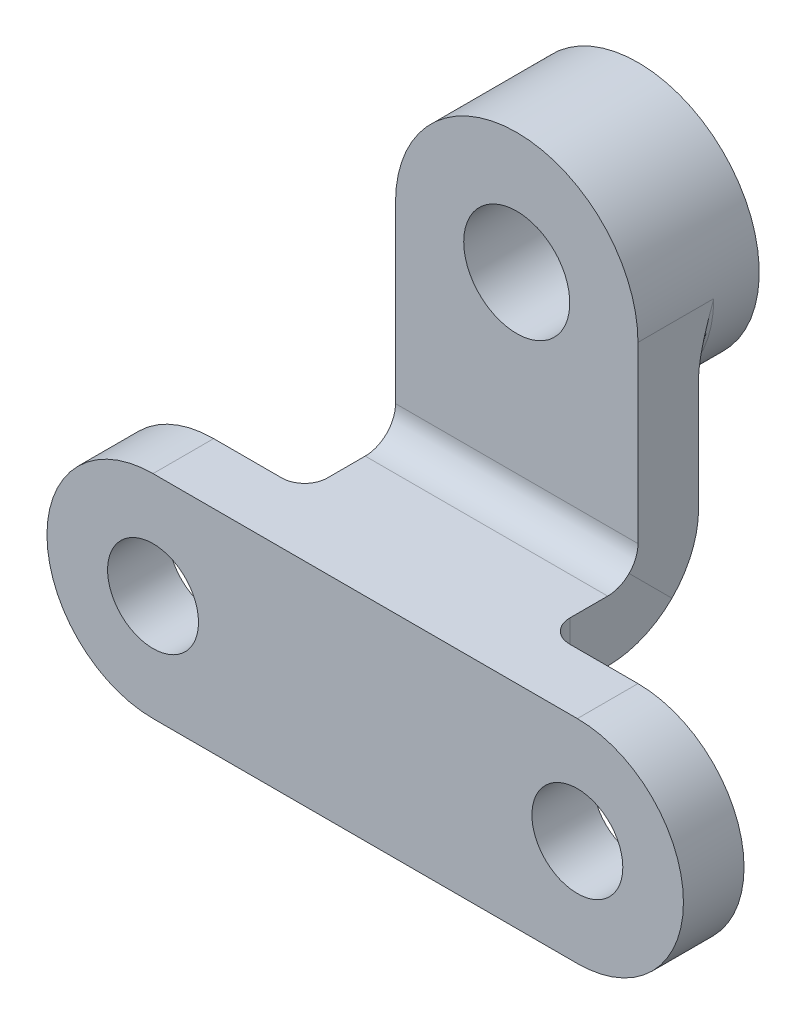
ISO-10303-21;
HEADER;
FILE_DESCRIPTION(('STEP AP214'),'2;1');
FILE_NAME('part.step','',(''),(''),'','','');
FILE_SCHEMA(('AUTOMOTIVE_DESIGN { 1 0 10303 214 1 1 1 1 }'));
ENDSEC;
DATA;
#1=APPLICATION_CONTEXT('core data for automotive mechanical design processes');
#2=APPLICATION_PROTOCOL_DEFINITION('international standard','automotive_design',2000,#1);
#3=PRODUCT_CONTEXT('',#1,'mechanical');
#4=PRODUCT('Part','Part','',(#3));
#5=PRODUCT_RELATED_PRODUCT_CATEGORY('part','',(#4));
#6=PRODUCT_DEFINITION_FORMATION('','',#4);
#7=PRODUCT_DEFINITION_CONTEXT('part definition',#1,'design');
#8=PRODUCT_DEFINITION('design','',#6,#7);
#9=PRODUCT_DEFINITION_SHAPE('','',#8);
#10=(LENGTH_UNIT() NAMED_UNIT(*) SI_UNIT(.MILLI.,.METRE.));
#11=(NAMED_UNIT(*) PLANE_ANGLE_UNIT() SI_UNIT($,.RADIAN.));
#12=(NAMED_UNIT(*) SI_UNIT($,.STERADIAN.) SOLID_ANGLE_UNIT());
#13=UNCERTAINTY_MEASURE_WITH_UNIT(LENGTH_MEASURE(1.E-05),#10,'distance_accuracy_value','');
#14=(GEOMETRIC_REPRESENTATION_CONTEXT(3) GLOBAL_UNCERTAINTY_ASSIGNED_CONTEXT((#13)) GLOBAL_UNIT_ASSIGNED_CONTEXT((#10,
#11,#12)) REPRESENTATION_CONTEXT('',''));
#15=CARTESIAN_POINT('',(0.,0.,0.));
#16=DIRECTION('',(0.,0.,1.));
#17=DIRECTION('',(1.,0.,0.));
#18=AXIS2_PLACEMENT_3D('',#15,#16,#17);
#19=CARTESIAN_POINT('',(20.,6.9,-25.));
#20=DIRECTION('',(0.,0.,-1.));
#21=DIRECTION('',(-1.,0.,0.));
#22=AXIS2_PLACEMENT_3D('',#19,#20,#21);
#23=PLANE('',#22);
#24=DIRECTION('',(0.,1.,0.));
#25=VECTOR('',#24,1.);
#26=CARTESIAN_POINT('',(-20.,6.9,-25.));
#27=LINE('',#26,#25);
#28=CARTESIAN_POINT('',(-20.,22.5,-25.));
#29=VERTEX_POINT('',#28);
#30=CARTESIAN_POINT('',(-20.,40.9422359359558,-25.));
#31=VERTEX_POINT('',#30);
#32=EDGE_CURVE('E212',#29,#31,#27,.T.);
#33=ORIENTED_EDGE('',*,*,#32,.T.);
#34=CARTESIAN_POINT('',(0.,51.25,-25.));
#35=DIRECTION('',(0.,0.,-1.));
#36=DIRECTION('',(-1.,0.,0.));
#37=AXIS2_PLACEMENT_3D('',#34,#35,#36);
#38=CIRCLE('',#37,22.5);
#39=CARTESIAN_POINT('',(20.,40.9422359359558,-25.));
#40=VERTEX_POINT('',#39);
#41=EDGE_CURVE('E325',#31,#40,#38,.F.);
#42=ORIENTED_EDGE('',*,*,#41,.T.);
#43=DIRECTION('',(0.,1.,0.));
#44=VECTOR('',#43,1.);
#45=CARTESIAN_POINT('',(20.,6.9,-25.));
#46=LINE('',#45,#44);
#47=CARTESIAN_POINT('',(20.,22.5,-25.));
#48=VERTEX_POINT('',#47);
#49=EDGE_CURVE('E208',#48,#40,#46,.T.);
#50=ORIENTED_EDGE('',*,*,#49,.F.);
#51=DIRECTION('',(1.,0.,0.));
#52=VECTOR('',#51,1.);
#53=CARTESIAN_POINT('',(20.,22.5,-25.));
#54=LINE('',#53,#52);
#55=EDGE_CURVE('E310',#48,#29,#54,.F.);
#56=ORIENTED_EDGE('',*,*,#55,.T.);
#57=EDGE_LOOP('',(#33,#42,#50,#56));
#58=FACE_BOUND('',#57,.T.);
#59=ADVANCED_FACE('F44',(#58),#23,.T.);
#60=CARTESIAN_POINT('',(-20.,6.9,-15.));
#61=DIRECTION('',(-1.,0.,0.));
#62=DIRECTION('',(0.,0.,1.));
#63=AXIS2_PLACEMENT_3D('',#60,#61,#62);
#64=PLANE('',#63);
#65=DIRECTION('',(0.,1.,0.));
#66=VECTOR('',#65,1.);
#67=CARTESIAN_POINT('',(-20.,6.9,-15.));
#68=LINE('',#67,#66);
#69=CARTESIAN_POINT('',(-20.,22.5,-15.));
#70=VERTEX_POINT('',#69);
#71=CARTESIAN_POINT('',(-20.,51.25,-15.));
#72=VERTEX_POINT('',#71);
#73=EDGE_CURVE('E203',#70,#72,#68,.T.);
#74=ORIENTED_EDGE('',*,*,#73,.T.);
#75=DIRECTION('',(0.,0.,-1.));
#76=VECTOR('',#75,1.);
#77=CARTESIAN_POINT('',(-20.,51.25,-15.));
#78=LINE('',#77,#76);
#79=CARTESIAN_POINT('',(-20.,51.25,-27.5));
#80=VERTEX_POINT('',#79);
#81=EDGE_CURVE('E185',#72,#80,#78,.T.);
#82=ORIENTED_EDGE('',*,*,#81,.T.);
#83=CARTESIAN_POINT('',(-20.,40.9422359359558,-25.));
#84=CARTESIAN_POINT('',(-20.,41.1549385100876,-25.0000449764851));
#85=CARTESIAN_POINT('',(-20.,41.3675707273067,-25.0056945692452));
#86=CARTESIAN_POINT('',(-20.,41.7922321200289,-25.0268780276172));
#87=CARTESIAN_POINT('',(-20.,42.0042615679865,-25.0424063173453));
#88=CARTESIAN_POINT('',(-20.,42.4269762163832,-25.0819766027299));
#89=CARTESIAN_POINT('',(-20.,42.6376634390875,-25.1059976023904));
#90=CARTESIAN_POINT('',(-20.,43.0580713599332,-25.1615157552071));
#91=CARTESIAN_POINT('',(-20.,43.2677919000022,-25.1930140897336));
#92=CARTESIAN_POINT('',(-20.,43.8920865101934,-25.2967730019633));
#93=CARTESIAN_POINT('',(-20.,44.305072940473,-25.3786349271692));
#94=CARTESIAN_POINT('',(-20.,45.1267992180475,-25.5621731553434));
#95=CARTESIAN_POINT('',(-20.,45.5355358287488,-25.6638635395823));
#96=CARTESIAN_POINT('',(-20.,46.3890349229857,-25.8930268313263));
#97=CARTESIAN_POINT('',(-20.,46.8333760284888,-26.022053241113));
#98=CARTESIAN_POINT('',(-20.,47.7179860727412,-26.2929067219359));
#99=CARTESIAN_POINT('',(-20.,48.1582558066702,-26.4347312325629));
#100=CARTESIAN_POINT('',(-20.,49.4762792108555,-26.8729727330476));
#101=CARTESIAN_POINT('',(-20.,50.3498647837027,-27.1817549134738));
#102=CARTESIAN_POINT('',(-20.,51.2322222285168,-27.4937146196007));
#103=CARTESIAN_POINT('',(-20.,51.2411111174545,-27.4968573166572));
#104=CARTESIAN_POINT('',(-20.,51.25,-27.5));
#105=B_SPLINE_CURVE_WITH_KNOTS('',3,(#83,#84,#85,#86,#87,#88,#89,#90,#91,#92,#93,#94,#95,#96,
#97,#98,#99,#100,#101,#102,#103,#104),.UNSPECIFIED.,.F.,.F.,(4,2,2,2,2,2,2,2,2,2,4),(0.,
0.637933377938518,1.27550700293499,1.91151529126964,2.54762413173433,3.80997097214285,
5.0732175604964,6.46101482448389,7.84853505640759,10.627891140098,10.656175411361),.UNSPECIFIED.);
#106=EDGE_CURVE('E324',#80,#31,#105,.F.);
#107=ORIENTED_EDGE('',*,*,#106,.T.);
#108=ORIENTED_EDGE('',*,*,#32,.F.);
#109=CARTESIAN_POINT('',(-20.,22.5,-10.));
#110=DIRECTION('',(-1.,0.,0.));
#111=DIRECTION('',(0.,0.,1.));
#112=AXIS2_PLACEMENT_3D('',#109,#110,#111);
#113=CIRCLE('',#112,15.);
#114=CARTESIAN_POINT('',(-20.,11.8933982822018,-20.6066017177982));
#115=VERTEX_POINT('',#114);
#116=EDGE_CURVE('E315',#29,#115,#113,.T.);
#117=ORIENTED_EDGE('',*,*,#116,.T.);
#118=DIRECTION('',(0.,-0.707106781186548,-0.707106781186548));
#119=VECTOR('',#118,1.);
#120=CARTESIAN_POINT('',(-20.,25.,-7.5));
#121=LINE('',#120,#119);
#122=CARTESIAN_POINT('',(-20.,18.9644660940673,-13.5355339059327));
#123=VERTEX_POINT('',#122);
#124=EDGE_CURVE('E229',#123,#115,#121,.T.);
#125=ORIENTED_EDGE('',*,*,#124,.F.);
#126=CARTESIAN_POINT('',(-20.,22.5,-10.));
#127=DIRECTION('',(-1.,0.,0.));
#128=DIRECTION('',(0.,0.,1.));
#129=AXIS2_PLACEMENT_3D('',#126,#127,#128);
#130=CIRCLE('',#129,5.);
#131=EDGE_CURVE('E287',#123,#70,#130,.F.);
#132=ORIENTED_EDGE('',*,*,#131,.T.);
#133=EDGE_LOOP('',(#74,#82,#107,#108,#117,#125,#132));
#134=FACE_BOUND('',#133,.T.);
#135=ADVANCED_FACE('F338',(#134),#64,.T.);
#136=CARTESIAN_POINT('',(-35.,0.,0.));
#137=DIRECTION('',(0.,0.,1.));
#138=DIRECTION('',(1.,0.,0.));
#139=AXIS2_PLACEMENT_3D('',#136,#137,#138);
#140=PLANE('',#139);
#141=CARTESIAN_POINT('',(35.,0.,0.));
#142=DIRECTION('',(0.,0.,1.));
#143=DIRECTION('',(1.,0.,0.));
#144=AXIS2_PLACEMENT_3D('',#141,#142,#143);
#145=CIRCLE('',#144,7.5);
#146=CARTESIAN_POINT('',(42.5,0.,0.));
#147=VERTEX_POINT('',#146);
#148=EDGE_CURVE('E224',#147,#147,#145,.T.);
#149=ORIENTED_EDGE('',*,*,#148,.T.);
#150=EDGE_LOOP('',(#149));
#151=FACE_BOUND('',#150,.T.);
#152=CARTESIAN_POINT('',(-35.,0.,0.));
#153=DIRECTION('',(0.,0.,1.));
#154=DIRECTION('',(1.,0.,0.));
#155=AXIS2_PLACEMENT_3D('',#152,#153,#154);
#156=CIRCLE('',#155,7.5);
#157=CARTESIAN_POINT('',(-27.5,0.,0.));
#158=VERTEX_POINT('',#157);
#159=EDGE_CURVE('E225',#158,#158,#156,.T.);
#160=ORIENTED_EDGE('',*,*,#159,.T.);
#161=EDGE_LOOP('',(#160));
#162=FACE_BOUND('',#161,.T.);
#163=DIRECTION('',(0.,1.,0.));
#164=VECTOR('',#163,1.);
#165=CARTESIAN_POINT('',(-23.75,0.,0.));
#166=LINE('',#165,#164);
#167=CARTESIAN_POINT('',(-23.75,17.5,0.));
#168=VERTEX_POINT('',#167);
#169=CARTESIAN_POINT('',(-23.75,5.,0.));
#170=VERTEX_POINT('',#169);
#171=EDGE_CURVE('E66',#168,#170,#166,.F.);
#172=ORIENTED_EDGE('',*,*,#171,.T.);
#173=DIRECTION('',(-1.,0.,0.));
#174=VECTOR('',#173,1.);
#175=CARTESIAN_POINT('',(-35.,5.,0.));
#176=LINE('',#175,#174);
#177=CARTESIAN_POINT('',(23.75,5.,0.));
#178=VERTEX_POINT('',#177);
#179=EDGE_CURVE('E368',#170,#178,#176,.F.);
#180=ORIENTED_EDGE('',*,*,#179,.T.);
#181=DIRECTION('',(0.,-1.,0.));
#182=VECTOR('',#181,1.);
#183=CARTESIAN_POINT('',(23.75,0.,0.));
#184=LINE('',#183,#182);
#185=CARTESIAN_POINT('',(23.75,17.5,0.));
#186=VERTEX_POINT('',#185);
#187=EDGE_CURVE('E71',#178,#186,#184,.F.);
#188=ORIENTED_EDGE('',*,*,#187,.T.);
#189=DIRECTION('',(-1.,0.,0.));
#190=VECTOR('',#189,1.);
#191=CARTESIAN_POINT('',(-35.,17.5,0.));
#192=LINE('',#191,#190);
#193=CARTESIAN_POINT('',(35.,17.5,0.));
#194=VERTEX_POINT('',#193);
#195=EDGE_CURVE('E242',#194,#186,#192,.T.);
#196=ORIENTED_EDGE('',*,*,#195,.F.);
#197=CARTESIAN_POINT('',(35.,0.,0.));
#198=DIRECTION('',(0.,0.,1.));
#199=DIRECTION('',(1.,0.,0.));
#200=AXIS2_PLACEMENT_3D('',#197,#198,#199);
#201=CIRCLE('',#200,17.5);
#202=CARTESIAN_POINT('',(35.,-17.5,0.));
#203=VERTEX_POINT('',#202);
#204=EDGE_CURVE('E260',#203,#194,#201,.T.);
#205=ORIENTED_EDGE('',*,*,#204,.F.);
#206=DIRECTION('',(1.,0.,0.));
#207=VECTOR('',#206,1.);
#208=CARTESIAN_POINT('',(-35.,-17.5,0.));
#209=LINE('',#208,#207);
#210=CARTESIAN_POINT('',(-35.,-17.5,0.));
#211=VERTEX_POINT('',#210);
#212=EDGE_CURVE('E255',#211,#203,#209,.T.);
#213=ORIENTED_EDGE('',*,*,#212,.F.);
#214=CARTESIAN_POINT('',(-35.,0.,0.));
#215=DIRECTION('',(0.,0.,1.));
#216=DIRECTION('',(1.,0.,0.));
#217=AXIS2_PLACEMENT_3D('',#214,#215,#216);
#218=CIRCLE('',#217,17.5);
#219=CARTESIAN_POINT('',(-35.,17.5,0.));
#220=VERTEX_POINT('',#219);
#221=EDGE_CURVE('E235',#220,#211,#218,.T.);
#222=ORIENTED_EDGE('',*,*,#221,.F.);
#223=EDGE_CURVE('E257',#168,#220,#192,.T.);
#224=ORIENTED_EDGE('',*,*,#223,.F.);
#225=EDGE_LOOP('',(#172,#180,#188,#196,#205,#213,#222,#224));
#226=FACE_BOUND('',#225,.T.);
#227=ADVANCED_FACE('F462',(#151,#162,#226),#140,.F.);
#228=CARTESIAN_POINT('',(-35.,0.,10.));
#229=DIRECTION('',(0.,0.,1.));
#230=DIRECTION('',(1.,0.,0.));
#231=AXIS2_PLACEMENT_3D('',#228,#229,#230);
#232=PLANE('',#231);
#233=CARTESIAN_POINT('',(-35.,0.,10.));
#234=DIRECTION('',(0.,0.,1.));
#235=DIRECTION('',(1.,0.,0.));
#236=AXIS2_PLACEMENT_3D('',#233,#234,#235);
#237=CIRCLE('',#236,7.5);
#238=CARTESIAN_POINT('',(-27.5,0.,10.));
#239=VERTEX_POINT('',#238);
#240=EDGE_CURVE('E230',#239,#239,#237,.T.);
#241=ORIENTED_EDGE('',*,*,#240,.F.);
#242=EDGE_LOOP('',(#241));
#243=FACE_BOUND('',#242,.T.);
#244=CARTESIAN_POINT('',(-35.,0.,10.));
#245=DIRECTION('',(0.,0.,1.));
#246=DIRECTION('',(1.,0.,0.));
#247=AXIS2_PLACEMENT_3D('',#244,#245,#246);
#248=CIRCLE('',#247,17.5);
#249=CARTESIAN_POINT('',(-35.,17.5,10.));
#250=VERTEX_POINT('',#249);
#251=CARTESIAN_POINT('',(-35.,-17.5,10.));
#252=VERTEX_POINT('',#251);
#253=EDGE_CURVE('E237',#250,#252,#248,.T.);
#254=ORIENTED_EDGE('',*,*,#253,.T.);
#255=DIRECTION('',(1.,0.,0.));
#256=VECTOR('',#255,1.);
#257=CARTESIAN_POINT('',(-35.,-17.5,10.));
#258=LINE('',#257,#256);
#259=CARTESIAN_POINT('',(35.,-17.5,10.));
#260=VERTEX_POINT('',#259);
#261=EDGE_CURVE('E238',#252,#260,#258,.T.);
#262=ORIENTED_EDGE('',*,*,#261,.T.);
#263=CARTESIAN_POINT('',(35.,0.,10.));
#264=DIRECTION('',(0.,0.,1.));
#265=DIRECTION('',(1.,0.,0.));
#266=AXIS2_PLACEMENT_3D('',#263,#264,#265);
#267=CIRCLE('',#266,17.5);
#268=CARTESIAN_POINT('',(35.,17.5,10.));
#269=VERTEX_POINT('',#268);
#270=EDGE_CURVE('E241',#260,#269,#267,.T.);
#271=ORIENTED_EDGE('',*,*,#270,.T.);
#272=DIRECTION('',(-1.,0.,0.));
#273=VECTOR('',#272,1.);
#274=CARTESIAN_POINT('',(-35.,17.5,10.));
#275=LINE('',#274,#273);
#276=EDGE_CURVE('E250',#269,#250,#275,.T.);
#277=ORIENTED_EDGE('',*,*,#276,.T.);
#278=EDGE_LOOP('',(#254,#262,#271,#277));
#279=FACE_BOUND('',#278,.T.);
#280=CARTESIAN_POINT('',(35.,0.,10.));
#281=DIRECTION('',(0.,0.,1.));
#282=DIRECTION('',(1.,0.,0.));
#283=AXIS2_PLACEMENT_3D('',#280,#281,#282);
#284=CIRCLE('',#283,7.5);
#285=CARTESIAN_POINT('',(42.5,0.,10.));
#286=VERTEX_POINT('',#285);
#287=EDGE_CURVE('E217',#286,#286,#284,.T.);
#288=ORIENTED_EDGE('',*,*,#287,.F.);
#289=EDGE_LOOP('',(#288));
#290=FACE_BOUND('',#289,.T.);
#291=ADVANCED_FACE('F508',(#243,#279,#290),#232,.T.);
#292=CARTESIAN_POINT('',(-35.,0.,10.));
#293=DIRECTION('',(0.,0.,-1.));
#294=DIRECTION('',(-1.,0.,0.));
#295=AXIS2_PLACEMENT_3D('',#292,#293,#294);
#296=CYLINDRICAL_SURFACE('',#295,17.5);
#297=ORIENTED_EDGE('',*,*,#221,.T.);
#298=DIRECTION('',(0.,0.,-1.));
#299=VECTOR('',#298,1.);
#300=CARTESIAN_POINT('',(-35.,-17.5,10.));
#301=LINE('',#300,#299);
#302=EDGE_CURVE('E274',#252,#211,#301,.T.);
#303=ORIENTED_EDGE('',*,*,#302,.F.);
#304=ORIENTED_EDGE('',*,*,#253,.F.);
#305=DIRECTION('',(0.,0.,-1.));
#306=VECTOR('',#305,1.);
#307=CARTESIAN_POINT('',(-35.,17.5,10.));
#308=LINE('',#307,#306);
#309=EDGE_CURVE('E249',#250,#220,#308,.T.);
#310=ORIENTED_EDGE('',*,*,#309,.T.);
#311=EDGE_LOOP('',(#297,#303,#304,#310));
#312=FACE_BOUND('',#311,.T.);
#313=ADVANCED_FACE('F504',(#312),#296,.T.);
#314=CARTESIAN_POINT('',(-35.,-17.5,10.));
#315=DIRECTION('',(0.,1.,0.));
#316=DIRECTION('',(0.,0.,1.));
#317=AXIS2_PLACEMENT_3D('',#314,#315,#316);
#318=PLANE('',#317);
#319=ORIENTED_EDGE('',*,*,#212,.T.);
#320=DIRECTION('',(0.,0.,-1.));
#321=VECTOR('',#320,1.);
#322=CARTESIAN_POINT('',(35.,-17.5,10.));
#323=LINE('',#322,#321);
#324=EDGE_CURVE('E271',#260,#203,#323,.T.);
#325=ORIENTED_EDGE('',*,*,#324,.F.);
#326=ORIENTED_EDGE('',*,*,#261,.F.);
#327=ORIENTED_EDGE('',*,*,#302,.T.);
#328=EDGE_LOOP('',(#319,#325,#326,#327));
#329=FACE_BOUND('',#328,.T.);
#330=ADVANCED_FACE('F635',(#329),#318,.F.);
#331=CARTESIAN_POINT('',(35.,0.,10.));
#332=DIRECTION('',(0.,0.,-1.));
#333=DIRECTION('',(-1.,0.,0.));
#334=AXIS2_PLACEMENT_3D('',#331,#332,#333);
#335=CYLINDRICAL_SURFACE('',#334,17.5);
#336=ORIENTED_EDGE('',*,*,#204,.T.);
#337=DIRECTION('',(0.,0.,-1.));
#338=VECTOR('',#337,1.);
#339=CARTESIAN_POINT('',(35.,17.5,10.));
#340=LINE('',#339,#338);
#341=EDGE_CURVE('E270',#269,#194,#340,.T.);
#342=ORIENTED_EDGE('',*,*,#341,.F.);
#343=ORIENTED_EDGE('',*,*,#270,.F.);
#344=ORIENTED_EDGE('',*,*,#324,.T.);
#345=EDGE_LOOP('',(#336,#342,#343,#344));
#346=FACE_BOUND('',#345,.T.);
#347=ADVANCED_FACE('F511',(#346),#335,.T.);
#348=CARTESIAN_POINT('',(-35.,17.5,10.));
#349=DIRECTION('',(0.,-1.,0.));
#350=DIRECTION('',(0.,0.,-1.));
#351=AXIS2_PLACEMENT_3D('',#348,#349,#350);
#352=PLANE('',#351);
#353=ORIENTED_EDGE('',*,*,#195,.T.);
#354=CARTESIAN_POINT('',(23.75,17.5,-3.75));
#355=DIRECTION('',(0.,-1.,0.));
#356=DIRECTION('',(0.,0.,-1.));
#357=AXIS2_PLACEMENT_3D('',#354,#355,#356);
#358=CIRCLE('',#357,3.75);
#359=CARTESIAN_POINT('',(20.,17.5,-3.75));
#360=VERTEX_POINT('',#359);
#361=EDGE_CURVE('E373',#186,#360,#358,.T.);
#362=ORIENTED_EDGE('',*,*,#361,.T.);
#363=DIRECTION('',(0.,0.,-1.));
#364=VECTOR('',#363,1.);
#365=CARTESIAN_POINT('',(20.,17.5,0.));
#366=LINE('',#365,#364);
#367=CARTESIAN_POINT('',(20.,17.5,-10.));
#368=VERTEX_POINT('',#367);
#369=EDGE_CURVE('E210',#360,#368,#366,.T.);
#370=ORIENTED_EDGE('',*,*,#369,.T.);
#371=DIRECTION('',(-1.,0.,0.));
#372=VECTOR('',#371,1.);
#373=CARTESIAN_POINT('',(-35.,17.5,-10.));
#374=LINE('',#373,#372);
#375=CARTESIAN_POINT('',(-20.,17.5,-10.));
#376=VERTEX_POINT('',#375);
#377=EDGE_CURVE('E276',#368,#376,#374,.T.);
#378=ORIENTED_EDGE('',*,*,#377,.T.);
#379=DIRECTION('',(0.,0.,-1.));
#380=VECTOR('',#379,1.);
#381=CARTESIAN_POINT('',(-20.,17.5,0.));
#382=LINE('',#381,#380);
#383=CARTESIAN_POINT('',(-20.,17.5,-3.75));
#384=VERTEX_POINT('',#383);
#385=EDGE_CURVE('E410',#384,#376,#382,.T.);
#386=ORIENTED_EDGE('',*,*,#385,.F.);
#387=CARTESIAN_POINT('',(-23.75,17.5,-3.75));
#388=DIRECTION('',(0.,-1.,0.));
#389=DIRECTION('',(0.,0.,-1.));
#390=AXIS2_PLACEMENT_3D('',#387,#388,#389);
#391=CIRCLE('',#390,3.75);
#392=EDGE_CURVE('E382',#384,#168,#391,.T.);
#393=ORIENTED_EDGE('',*,*,#392,.T.);
#394=ORIENTED_EDGE('',*,*,#223,.T.);
#395=ORIENTED_EDGE('',*,*,#309,.F.);
#396=ORIENTED_EDGE('',*,*,#276,.F.);
#397=ORIENTED_EDGE('',*,*,#341,.T.);
#398=EDGE_LOOP('',(#353,#362,#370,#378,#386,#393,#394,#395,#396,#397));
#399=FACE_BOUND('',#398,.T.);
#400=ADVANCED_FACE('F497',(#399),#352,.F.);
#401=CARTESIAN_POINT('',(-35.,0.,10.));
#402=DIRECTION('',(0.,0.,-1.));
#403=DIRECTION('',(-1.,0.,0.));
#404=AXIS2_PLACEMENT_3D('',#401,#402,#403);
#405=CYLINDRICAL_SURFACE('',#404,7.5);
#406=ORIENTED_EDGE('',*,*,#240,.T.);
#407=EDGE_LOOP('',(#406));
#408=FACE_BOUND('',#407,.T.);
#409=ORIENTED_EDGE('',*,*,#159,.F.);
#410=EDGE_LOOP('',(#409));
#411=FACE_BOUND('',#410,.T.);
#412=ADVANCED_FACE('F562',(#408,#411),#405,.F.);
#413=CARTESIAN_POINT('',(35.,0.,10.));
#414=DIRECTION('',(0.,0.,-1.));
#415=DIRECTION('',(-1.,0.,0.));
#416=AXIS2_PLACEMENT_3D('',#413,#414,#415);
#417=CYLINDRICAL_SURFACE('',#416,7.5);
#418=ORIENTED_EDGE('',*,*,#287,.T.);
#419=EDGE_LOOP('',(#418));
#420=FACE_BOUND('',#419,.T.);
#421=ORIENTED_EDGE('',*,*,#148,.F.);
#422=EDGE_LOOP('',(#421));
#423=FACE_BOUND('',#422,.T.);
#424=ADVANCED_FACE('F463',(#420,#423),#417,.F.);
#425=CARTESIAN_POINT('',(20.,6.9,-15.));
#426=DIRECTION('',(1.,0.,0.));
#427=DIRECTION('',(0.,0.,-1.));
#428=AXIS2_PLACEMENT_3D('',#425,#426,#427);
#429=PLANE('',#428);
#430=DIRECTION('',(0.,0.,-1.));
#431=VECTOR('',#430,1.);
#432=CARTESIAN_POINT('',(20.,51.25,-15.));
#433=LINE('',#432,#431);
#434=CARTESIAN_POINT('',(20.,51.25,-15.));
#435=VERTEX_POINT('',#434);
#436=CARTESIAN_POINT('',(20.,51.25,-27.5));
#437=VERTEX_POINT('',#436);
#438=EDGE_CURVE('E179',#435,#437,#433,.T.);
#439=ORIENTED_EDGE('',*,*,#438,.F.);
#440=DIRECTION('',(0.,1.,0.));
#441=VECTOR('',#440,1.);
#442=CARTESIAN_POINT('',(20.,6.9,-15.));
#443=LINE('',#442,#441);
#444=CARTESIAN_POINT('',(20.,22.5,-15.));
#445=VERTEX_POINT('',#444);
#446=EDGE_CURVE('E192',#445,#435,#443,.T.);
#447=ORIENTED_EDGE('',*,*,#446,.F.);
#448=CARTESIAN_POINT('',(20.,22.5,-10.));
#449=DIRECTION('',(1.,0.,0.));
#450=DIRECTION('',(0.,0.,-1.));
#451=AXIS2_PLACEMENT_3D('',#448,#449,#450);
#452=CIRCLE('',#451,5.);
#453=CARTESIAN_POINT('',(20.,18.9644660940673,-13.5355339059327));
#454=VERTEX_POINT('',#453);
#455=EDGE_CURVE('E295',#445,#454,#452,.F.);
#456=ORIENTED_EDGE('',*,*,#455,.T.);
#457=DIRECTION('',(0.,0.707106781186548,0.707106781186548));
#458=VECTOR('',#457,1.);
#459=CARTESIAN_POINT('',(20.,25.,-7.5));
#460=LINE('',#459,#458);
#461=CARTESIAN_POINT('',(20.,11.8933982822018,-20.6066017177982));
#462=VERTEX_POINT('',#461);
#463=EDGE_CURVE('E403',#462,#454,#460,.T.);
#464=ORIENTED_EDGE('',*,*,#463,.F.);
#465=CARTESIAN_POINT('',(20.,22.5,-10.));
#466=DIRECTION('',(1.,0.,0.));
#467=DIRECTION('',(0.,0.,-1.));
#468=AXIS2_PLACEMENT_3D('',#465,#466,#467);
#469=CIRCLE('',#468,15.);
#470=EDGE_CURVE('E308',#462,#48,#469,.T.);
#471=ORIENTED_EDGE('',*,*,#470,.T.);
#472=ORIENTED_EDGE('',*,*,#49,.T.);
#473=CARTESIAN_POINT('',(20.,40.9422359359558,-25.));
#474=CARTESIAN_POINT('',(20.,41.1549385100884,-25.0000449764851));
#475=CARTESIAN_POINT('',(20.,41.3675707273082,-25.0056945692452));
#476=CARTESIAN_POINT('',(20.,41.7922321200321,-25.0268780276174));
#477=CARTESIAN_POINT('',(20.,42.0042615679905,-25.0424063173456));
#478=CARTESIAN_POINT('',(20.,42.4269762163886,-25.0819766027305));
#479=CARTESIAN_POINT('',(20.,42.6376634390935,-25.1059976023911));
#480=CARTESIAN_POINT('',(20.,43.0580713599405,-25.1615157552081));
#481=CARTESIAN_POINT('',(20.,43.26779190001,-25.1930140897348));
#482=CARTESIAN_POINT('',(20.,43.8920865102003,-25.2967730019647));
#483=CARTESIAN_POINT('',(20.,44.3050729404784,-25.3786349271704));
#484=CARTESIAN_POINT('',(20.,45.1267992180501,-25.562173155344));
#485=CARTESIAN_POINT('',(20.,45.5355358287502,-25.6638635395823));
#486=CARTESIAN_POINT('',(20.,46.3890349229855,-25.8930268313266));
#487=CARTESIAN_POINT('',(20.,46.8333760284882,-26.0220532411141));
#488=CARTESIAN_POINT('',(20.,47.7179860727411,-26.2929067219345));
#489=CARTESIAN_POINT('',(20.,48.1582558066709,-26.4347312325581));
#490=CARTESIAN_POINT('',(20.,49.4762792108515,-26.8729727330565));
#491=CARTESIAN_POINT('',(19.9999999999999,50.3498647836848,-27.1817549135236));
#492=CARTESIAN_POINT('',(20.,51.2322222285165,-27.4937146196017));
#493=CARTESIAN_POINT('',(20.,51.2411111174543,-27.4968573166577));
#494=CARTESIAN_POINT('',(20.,51.25,-27.5));
#495=B_SPLINE_CURVE_WITH_KNOTS('',3,(#473,#474,#475,#476,#477,#478,#479,#480,#481,#482,#483,
#484,#485,#486,#487,#488,#489,#490,#491,#492,#493,#494),.UNSPECIFIED.,.F.,.F.,(4,2,2,2,2,2,2,2,
2,2,4),(0.,0.637933377940907,1.27550700293977,1.91151529127633,2.54762413174289,
3.80997097214691,5.0732175604964,6.46101482448358,7.84853505640639,10.627891140098,
10.656175411361),.UNSPECIFIED.);
#496=EDGE_CURVE('E196',#40,#437,#495,.T.);
#497=ORIENTED_EDGE('',*,*,#496,.T.);
#498=EDGE_LOOP('',(#439,#447,#456,#464,#471,#472,#497));
#499=FACE_BOUND('',#498,.T.);
#500=ADVANCED_FACE('F195',(#499),#429,.T.);
#501=CARTESIAN_POINT('',(20.,6.9,-15.));
#502=DIRECTION('',(0.,0.,1.));
#503=DIRECTION('',(1.,0.,0.));
#504=AXIS2_PLACEMENT_3D('',#501,#502,#503);
#505=PLANE('',#504);
#506=CARTESIAN_POINT('',(0.,51.25,-15.));
#507=DIRECTION('',(0.,0.,-1.));
#508=DIRECTION('',(-1.,0.,0.));
#509=AXIS2_PLACEMENT_3D('',#506,#507,#508);
#510=CIRCLE('',#509,8.75);
#511=CARTESIAN_POINT('',(-8.75,51.25,-15.));
#512=VERTEX_POINT('',#511);
#513=EDGE_CURVE('E442',#512,#512,#510,.T.);
#514=ORIENTED_EDGE('',*,*,#513,.T.);
#515=EDGE_LOOP('',(#514));
#516=FACE_BOUND('',#515,.T.);
#517=CARTESIAN_POINT('',(0.,51.25,-15.));
#518=DIRECTION('',(0.,0.,-1.));
#519=DIRECTION('',(-1.,0.,0.));
#520=AXIS2_PLACEMENT_3D('',#517,#518,#519);
#521=CIRCLE('',#520,20.);
#522=EDGE_CURVE('E173',#72,#435,#521,.T.);
#523=ORIENTED_EDGE('',*,*,#522,.F.);
#524=ORIENTED_EDGE('',*,*,#73,.F.);
#525=DIRECTION('',(-1.,0.,0.));
#526=VECTOR('',#525,1.);
#527=CARTESIAN_POINT('',(20.,22.5,-15.));
#528=LINE('',#527,#526);
#529=EDGE_CURVE('E202',#70,#445,#528,.F.);
#530=ORIENTED_EDGE('',*,*,#529,.T.);
#531=ORIENTED_EDGE('',*,*,#446,.T.);
#532=EDGE_LOOP('',(#523,#524,#530,#531));
#533=FACE_BOUND('',#532,.T.);
#534=ADVANCED_FACE('F201',(#516,#533),#505,.T.);
#535=CARTESIAN_POINT('',(-20.,17.5,0.));
#536=DIRECTION('',(-1.,0.,0.));
#537=DIRECTION('',(0.,0.,1.));
#538=AXIS2_PLACEMENT_3D('',#535,#536,#537);
#539=PLANE('',#538);
#540=DIRECTION('',(0.,0.,-1.));
#541=VECTOR('',#540,1.);
#542=CARTESIAN_POINT('',(-20.,7.5,0.));
#543=LINE('',#542,#541);
#544=CARTESIAN_POINT('',(-20.,7.5,-3.75));
#545=VERTEX_POINT('',#544);
#546=CARTESIAN_POINT('',(-20.,7.5,-10.));
#547=VERTEX_POINT('',#546);
#548=EDGE_CURVE('E411',#545,#547,#543,.T.);
#549=ORIENTED_EDGE('',*,*,#548,.F.);
#550=DIRECTION('',(0.,1.,0.));
#551=VECTOR('',#550,1.);
#552=CARTESIAN_POINT('',(-20.,17.5,-3.75));
#553=LINE('',#552,#551);
#554=EDGE_CURVE('E395',#545,#384,#553,.T.);
#555=ORIENTED_EDGE('',*,*,#554,.T.);
#556=ORIENTED_EDGE('',*,*,#385,.T.);
#557=CARTESIAN_POINT('',(-20.,22.5,-10.));
#558=DIRECTION('',(-1.,0.,0.));
#559=DIRECTION('',(0.,0.,1.));
#560=AXIS2_PLACEMENT_3D('',#557,#558,#559);
#561=CIRCLE('',#560,5.);
#562=EDGE_CURVE('E283',#376,#123,#561,.F.);
#563=ORIENTED_EDGE('',*,*,#562,.T.);
#564=ORIENTED_EDGE('',*,*,#124,.T.);
#565=CARTESIAN_POINT('',(-20.,22.5,-10.));
#566=DIRECTION('',(-1.,0.,0.));
#567=DIRECTION('',(0.,0.,1.));
#568=AXIS2_PLACEMENT_3D('',#565,#566,#567);
#569=CIRCLE('',#568,15.);
#570=EDGE_CURVE('E312',#115,#547,#569,.T.);
#571=ORIENTED_EDGE('',*,*,#570,.T.);
#572=EDGE_LOOP('',(#549,#555,#556,#563,#564,#571));
#573=FACE_BOUND('',#572,.T.);
#574=ADVANCED_FACE('F470',(#573),#539,.T.);
#575=CARTESIAN_POINT('',(20.,7.5,0.));
#576=DIRECTION('',(0.,-1.,0.));
#577=DIRECTION('',(0.,0.,-1.));
#578=AXIS2_PLACEMENT_3D('',#575,#576,#577);
#579=PLANE('',#578);
#580=CARTESIAN_POINT('',(23.75,7.5,-3.75));
#581=DIRECTION('',(0.,-1.,0.));
#582=DIRECTION('',(0.,0.,-1.));
#583=AXIS2_PLACEMENT_3D('',#580,#581,#582);
#584=CIRCLE('',#583,3.75);
#585=CARTESIAN_POINT('',(20.,7.5,-3.75));
#586=VERTEX_POINT('',#585);
#587=CARTESIAN_POINT('',(20.2144660940673,7.5,-2.5));
#588=VERTEX_POINT('',#587);
#589=EDGE_CURVE('E376',#586,#588,#584,.F.);
#590=ORIENTED_EDGE('',*,*,#589,.T.);
#591=DIRECTION('',(-1.,0.,0.));
#592=VECTOR('',#591,1.);
#593=CARTESIAN_POINT('',(20.,7.5,-2.5));
#594=LINE('',#593,#592);
#595=CARTESIAN_POINT('',(-20.2144660940673,7.5,-2.5));
#596=VERTEX_POINT('',#595);
#597=EDGE_CURVE('E369',#588,#596,#594,.T.);
#598=ORIENTED_EDGE('',*,*,#597,.T.);
#599=CARTESIAN_POINT('',(-23.75,7.5,-3.75));
#600=DIRECTION('',(0.,-1.,0.));
#601=DIRECTION('',(0.,0.,-1.));
#602=AXIS2_PLACEMENT_3D('',#599,#600,#601);
#603=CIRCLE('',#602,3.75);
#604=EDGE_CURVE('E379',#596,#545,#603,.F.);
#605=ORIENTED_EDGE('',*,*,#604,.T.);
#606=ORIENTED_EDGE('',*,*,#548,.T.);
#607=DIRECTION('',(1.,0.,0.));
#608=VECTOR('',#607,1.);
#609=CARTESIAN_POINT('',(20.,7.5,-10.));
#610=LINE('',#609,#608);
#611=CARTESIAN_POINT('',(20.,7.5,-10.));
#612=VERTEX_POINT('',#611);
#613=EDGE_CURVE('E296',#547,#612,#610,.T.);
#614=ORIENTED_EDGE('',*,*,#613,.T.);
#615=DIRECTION('',(0.,0.,-1.));
#616=VECTOR('',#615,1.);
#617=CARTESIAN_POINT('',(20.,7.5,0.));
#618=LINE('',#617,#616);
#619=EDGE_CURVE('E215',#586,#612,#618,.T.);
#620=ORIENTED_EDGE('',*,*,#619,.F.);
#621=EDGE_LOOP('',(#590,#598,#605,#606,#614,#620));
#622=FACE_BOUND('',#621,.T.);
#623=ADVANCED_FACE('F469',(#622),#579,.T.);
#624=CARTESIAN_POINT('',(20.,17.5,0.));
#625=DIRECTION('',(1.,0.,0.));
#626=DIRECTION('',(0.,1.,0.));
#627=AXIS2_PLACEMENT_3D('',#624,#625,#626);
#628=PLANE('',#627);
#629=ORIENTED_EDGE('',*,*,#369,.F.);
#630=DIRECTION('',(0.,-1.,0.));
#631=VECTOR('',#630,1.);
#632=CARTESIAN_POINT('',(20.,17.5,-3.75));
#633=LINE('',#632,#631);
#634=EDGE_CURVE('E387',#360,#586,#633,.T.);
#635=ORIENTED_EDGE('',*,*,#634,.T.);
#636=ORIENTED_EDGE('',*,*,#619,.T.);
#637=CARTESIAN_POINT('',(20.,22.5,-10.));
#638=DIRECTION('',(1.,0.,0.));
#639=DIRECTION('',(0.,1.,0.));
#640=AXIS2_PLACEMENT_3D('',#637,#638,#639);
#641=CIRCLE('',#640,15.);
#642=EDGE_CURVE('E303',#612,#462,#641,.T.);
#643=ORIENTED_EDGE('',*,*,#642,.T.);
#644=ORIENTED_EDGE('',*,*,#463,.T.);
#645=CARTESIAN_POINT('',(20.,22.5,-10.));
#646=DIRECTION('',(1.,0.,0.));
#647=DIRECTION('',(0.,1.,0.));
#648=AXIS2_PLACEMENT_3D('',#645,#646,#647);
#649=CIRCLE('',#648,5.);
#650=EDGE_CURVE('E293',#454,#368,#649,.F.);
#651=ORIENTED_EDGE('',*,*,#650,.T.);
#652=EDGE_LOOP('',(#629,#635,#636,#643,#644,#651));
#653=FACE_BOUND('',#652,.T.);
#654=ADVANCED_FACE('F471',(#653),#628,.T.);
#655=CARTESIAN_POINT('',(-35.,22.5,-10.));
#656=DIRECTION('',(-1.,0.,0.));
#657=DIRECTION('',(0.,0.,1.));
#658=AXIS2_PLACEMENT_3D('',#655,#656,#657);
#659=CYLINDRICAL_SURFACE('',#658,5.);
#660=ORIENTED_EDGE('',*,*,#455,.F.);
#661=ORIENTED_EDGE('',*,*,#529,.F.);
#662=ORIENTED_EDGE('',*,*,#131,.F.);
#663=ORIENTED_EDGE('',*,*,#562,.F.);
#664=ORIENTED_EDGE('',*,*,#377,.F.);
#665=ORIENTED_EDGE('',*,*,#650,.F.);
#666=EDGE_LOOP('',(#660,#661,#662,#663,#664,#665));
#667=FACE_BOUND('',#666,.T.);
#668=ADVANCED_FACE('F466',(#667),#659,.F.);
#669=CARTESIAN_POINT('',(20.,22.5,-10.));
#670=DIRECTION('',(1.,0.,0.));
#671=DIRECTION('',(0.,0.,-1.));
#672=AXIS2_PLACEMENT_3D('',#669,#670,#671);
#673=CYLINDRICAL_SURFACE('',#672,15.);
#674=ORIENTED_EDGE('',*,*,#116,.F.);
#675=ORIENTED_EDGE('',*,*,#55,.F.);
#676=ORIENTED_EDGE('',*,*,#470,.F.);
#677=ORIENTED_EDGE('',*,*,#642,.F.);
#678=ORIENTED_EDGE('',*,*,#613,.F.);
#679=ORIENTED_EDGE('',*,*,#570,.F.);
#680=EDGE_LOOP('',(#674,#675,#676,#677,#678,#679));
#681=FACE_BOUND('',#680,.T.);
#682=ADVANCED_FACE('F354',(#681),#673,.T.);
#683=CARTESIAN_POINT('',(0.,51.25,-15.));
#684=DIRECTION('',(0.,0.,-1.));
#685=DIRECTION('',(-1.,0.,0.));
#686=AXIS2_PLACEMENT_3D('',#683,#684,#685);
#687=CYLINDRICAL_SURFACE('',#686,20.);
#688=CARTESIAN_POINT('',(0.,51.25,-27.5));
#689=DIRECTION('',(0.,0.,-1.));
#690=DIRECTION('',(-1.,0.,0.));
#691=AXIS2_PLACEMENT_3D('',#688,#689,#690);
#692=CIRCLE('',#691,20.);
#693=EDGE_CURVE('E317',#437,#80,#692,.T.);
#694=ORIENTED_EDGE('',*,*,#693,.T.);
#695=ORIENTED_EDGE('',*,*,#81,.F.);
#696=ORIENTED_EDGE('',*,*,#522,.T.);
#697=ORIENTED_EDGE('',*,*,#438,.T.);
#698=EDGE_LOOP('',(#694,#695,#696,#697));
#699=FACE_BOUND('',#698,.T.);
#700=CARTESIAN_POINT('',(0.,51.25,-35.));
#701=DIRECTION('',(0.,0.,-1.));
#702=DIRECTION('',(-1.,0.,0.));
#703=AXIS2_PLACEMENT_3D('',#700,#701,#702);
#704=CIRCLE('',#703,20.);
#705=CARTESIAN_POINT('',(-20.,51.25,-35.));
#706=VERTEX_POINT('',#705);
#707=EDGE_CURVE('E190',#706,#706,#704,.T.);
#708=ORIENTED_EDGE('',*,*,#707,.F.);
#709=EDGE_LOOP('',(#708));
#710=FACE_BOUND('',#709,.T.);
#711=ADVANCED_FACE('F178',(#699,#710),#687,.T.);
#712=CARTESIAN_POINT('',(0.,51.25,-35.));
#713=DIRECTION('',(0.,0.,-1.));
#714=DIRECTION('',(-1.,0.,0.));
#715=AXIS2_PLACEMENT_3D('',#712,#713,#714);
#716=PLANE('',#715);
#717=ORIENTED_EDGE('',*,*,#707,.T.);
#718=EDGE_LOOP('',(#717));
#719=FACE_BOUND('',#718,.T.);
#720=CARTESIAN_POINT('',(0.,51.25,-35.));
#721=DIRECTION('',(0.,0.,-1.));
#722=DIRECTION('',(-1.,0.,0.));
#723=AXIS2_PLACEMENT_3D('',#720,#721,#722);
#724=CIRCLE('',#723,8.75);
#725=CARTESIAN_POINT('',(-8.75,51.25,-35.));
#726=VERTEX_POINT('',#725);
#727=EDGE_CURVE('E440',#726,#726,#724,.T.);
#728=ORIENTED_EDGE('',*,*,#727,.F.);
#729=EDGE_LOOP('',(#728));
#730=FACE_BOUND('',#729,.T.);
#731=ADVANCED_FACE('F450',(#719,#730),#716,.T.);
#732=CARTESIAN_POINT('',(0.,51.25,-35.));
#733=DIRECTION('',(0.,0.,1.));
#734=DIRECTION('',(1.,0.,0.));
#735=AXIS2_PLACEMENT_3D('',#732,#733,#734);
#736=CYLINDRICAL_SURFACE('',#735,8.75);
#737=ORIENTED_EDGE('',*,*,#727,.T.);
#738=EDGE_LOOP('',(#737));
#739=FACE_BOUND('',#738,.T.);
#740=ORIENTED_EDGE('',*,*,#513,.F.);
#741=EDGE_LOOP('',(#740));
#742=FACE_BOUND('',#741,.T.);
#743=ADVANCED_FACE('F348',(#739,#742),#736,.F.);
#744=CARTESIAN_POINT('',(0.,51.25,-27.5));
#745=DIRECTION('',(0.,0.,-1.));
#746=DIRECTION('',(-1.,0.,0.));
#747=AXIS2_PLACEMENT_3D('',#744,#745,#746);
#748=TOROIDAL_SURFACE('',#747,22.5,2.5);
#749=ORIENTED_EDGE('',*,*,#496,.F.);
#750=ORIENTED_EDGE('',*,*,#41,.F.);
#751=ORIENTED_EDGE('',*,*,#106,.F.);
#752=ORIENTED_EDGE('',*,*,#693,.F.);
#753=EDGE_LOOP('',(#749,#750,#751,#752));
#754=FACE_BOUND('',#753,.T.);
#755=ADVANCED_FACE('F342',(#754),#748,.F.);
#756=CARTESIAN_POINT('',(-23.75,17.5,-3.75));
#757=DIRECTION('',(0.,1.,0.));
#758=DIRECTION('',(0.,0.,1.));
#759=AXIS2_PLACEMENT_3D('',#756,#757,#758);
#760=CYLINDRICAL_SURFACE('',#759,3.75);
#761=ORIENTED_EDGE('',*,*,#604,.F.);
#762=CARTESIAN_POINT('',(-20.2144660940673,7.5,-2.5));
#763=CARTESIAN_POINT('',(-20.2393662040562,7.50001054021961,-2.42951993059913));
#764=CARTESIAN_POINT('',(-20.2663912830869,7.49702065461623,-2.35983639110862));
#765=CARTESIAN_POINT('',(-20.3243159475577,7.48552014309814,-2.2226863516426));
#766=CARTESIAN_POINT('',(-20.3552095421212,7.47701797038248,-2.15521662291185));
#767=CARTESIAN_POINT('',(-20.4202445791993,7.45508125961204,-2.0235662656966));
#768=CARTESIAN_POINT('',(-20.4543501429637,7.44169730559482,-1.95935933771233));
#769=CARTESIAN_POINT('',(-20.5257125083483,7.41047924169494,-1.83383381840814));
#770=CARTESIAN_POINT('',(-20.5629707891547,7.39264303517371,-1.77251660412036));
#771=CARTESIAN_POINT('',(-20.6965447387634,7.32415811474002,-1.56611591063627));
#772=CARTESIAN_POINT('',(-20.799992803107,7.26349573295886,-1.42880798088552));
#773=CARTESIAN_POINT('',(-21.0194059274663,7.12447792477093,-1.174175470512));
#774=CARTESIAN_POINT('',(-21.1354251872103,7.04604415533011,-1.05694353697233));
#775=CARTESIAN_POINT('',(-21.4229076528562,6.84365005364263,-0.800912673872533));
#776=CARTESIAN_POINT('',(-21.5984600380104,6.71381415178543,-0.671307984602351));
#777=CARTESIAN_POINT('',(-21.8693407211012,6.50783651956304,-0.503935771214345));
#778=CARTESIAN_POINT('',(-21.9609989763578,6.43722199247875,-0.45260891196859));
#779=CARTESIAN_POINT('',(-22.1463562789382,6.29298075456663,-0.358597352004741));
#780=CARTESIAN_POINT('',(-22.2400547640279,6.21935486879873,-0.315910302944019));
#781=CARTESIAN_POINT('',(-22.448954010883,6.0540062621041,-0.230760048606542));
#782=CARTESIAN_POINT('',(-22.5645207540852,5.96174261052038,-0.190243987026831));
#783=CARTESIAN_POINT('',(-22.7972353240641,5.77485255677569,-0.121020871242141));
#784=CARTESIAN_POINT('',(-22.9143836622826,5.68022538148272,-0.0923177362745401));
#785=CARTESIAN_POINT('',(-23.2668525909221,5.39448095959348,-0.0235735893896602));
#786=CARTESIAN_POINT('',(-23.5039204416213,5.20092302355828,-0.000610174232591767));
#787=CARTESIAN_POINT('',(-23.7436755307892,5.00516390560998,-4.00465731068803E-06));
#788=CARTESIAN_POINT('',(-23.7468378111919,5.0025819144332,-5.01005206418915E-09));
#789=CARTESIAN_POINT('',(-23.75,5.,0.));
#790=B_SPLINE_CURVE_WITH_KNOTS('',3,(#762,#763,#764,#765,#766,#767,#768,#769,#770,#771,#772,
#773,#774,#775,#776,#777,#778,#779,#780,#781,#782,#783,#784,#785,#786,#787,#788,#789),
.UNSPECIFIED.,.F.,.F.,(4,2,2,2,2,2,2,2,2,2,2,2,2,4),(0.,0.224090149865178,0.447837463386177,
0.669329319824633,0.890925677829895,1.43458243996467,1.9806841593469,2.73799264353324,
3.11749078362235,3.49688563533012,3.95632120340474,4.41590907821431,5.33220380672641,
5.34445126131912),.UNSPECIFIED.);
#791=EDGE_CURVE('E56',#596,#170,#790,.T.);
#792=ORIENTED_EDGE('',*,*,#791,.T.);
#793=ORIENTED_EDGE('',*,*,#171,.F.);
#794=ORIENTED_EDGE('',*,*,#392,.F.);
#795=ORIENTED_EDGE('',*,*,#554,.F.);
#796=EDGE_LOOP('',(#761,#792,#793,#794,#795));
#797=FACE_BOUND('',#796,.T.);
#798=ADVANCED_FACE('F349',(#797),#760,.F.);
#799=CARTESIAN_POINT('',(23.75,17.5,-3.75));
#800=DIRECTION('',(0.,-1.,0.));
#801=DIRECTION('',(1.,0.,0.));
#802=AXIS2_PLACEMENT_3D('',#799,#800,#801);
#803=CYLINDRICAL_SURFACE('',#802,3.75);
#804=ORIENTED_EDGE('',*,*,#361,.F.);
#805=ORIENTED_EDGE('',*,*,#187,.F.);
#806=CARTESIAN_POINT('',(20.2144660940673,7.5,-2.5));
#807=CARTESIAN_POINT('',(20.2393662040562,7.50001054021961,-2.42951993059913));
#808=CARTESIAN_POINT('',(20.2663912830869,7.49702065461623,-2.35983639110862));
#809=CARTESIAN_POINT('',(20.3243159475577,7.48552014309814,-2.22268635164261));
#810=CARTESIAN_POINT('',(20.3552095421211,7.47701797038248,-2.15521662291185));
#811=CARTESIAN_POINT('',(20.4202445791993,7.45508125961204,-2.02356626569661));
#812=CARTESIAN_POINT('',(20.4543501429637,7.44169730559482,-1.95935933771234));
#813=CARTESIAN_POINT('',(20.5257125083483,7.41047924169494,-1.83383381840814));
#814=CARTESIAN_POINT('',(20.5629707891547,7.39264303517371,-1.77251660412036));
#815=CARTESIAN_POINT('',(20.6965447387634,7.32415811474002,-1.56611591063627));
#816=CARTESIAN_POINT('',(20.799992803107,7.26349573295886,-1.42880798088552));
#817=CARTESIAN_POINT('',(21.0194059274663,7.12447792477093,-1.174175470512));
#818=CARTESIAN_POINT('',(21.1354251872103,7.04604415533011,-1.05694353697233));
#819=CARTESIAN_POINT('',(21.4229076528562,6.84365005364263,-0.800912673872535));
#820=CARTESIAN_POINT('',(21.5984600380104,6.71381415178543,-0.671307984602354));
#821=CARTESIAN_POINT('',(21.8693407211012,6.50783651956304,-0.50393577121435));
#822=CARTESIAN_POINT('',(21.9609989763578,6.43722199247875,-0.452608911968595));
#823=CARTESIAN_POINT('',(22.1463562789382,6.29298075456664,-0.358597352004745));
#824=CARTESIAN_POINT('',(22.2400547640279,6.21935486879873,-0.315910302944022));
#825=CARTESIAN_POINT('',(22.448954010883,6.05400626210411,-0.230760048606543));
#826=CARTESIAN_POINT('',(22.5645207540852,5.96174261052041,-0.190243987026833));
#827=CARTESIAN_POINT('',(22.7972353240641,5.77485255677567,-0.121020871242142));
#828=CARTESIAN_POINT('',(22.9143836622825,5.68022538148261,-0.0923177362745407));
#829=CARTESIAN_POINT('',(23.2668525909222,5.39448095959369,-0.0235735893896595));
#830=CARTESIAN_POINT('',(23.5039204416223,5.20092302355943,-0.000610174232589282));
#831=CARTESIAN_POINT('',(23.7436755307892,5.00516390561001,-4.00465731061986E-06));
#832=CARTESIAN_POINT('',(23.7468378111919,5.00258191443321,-5.01005202864271E-09));
#833=CARTESIAN_POINT('',(23.75,5.,0.));
#834=B_SPLINE_CURVE_WITH_KNOTS('',3,(#806,#807,#808,#809,#810,#811,#812,#813,#814,#815,#816,
#817,#818,#819,#820,#821,#822,#823,#824,#825,#826,#827,#828,#829,#830,#831,#832,#833),
.UNSPECIFIED.,.F.,.F.,(4,2,2,2,2,2,2,2,2,2,2,2,2,4),(0.,0.224090149865176,0.447837463386171,
0.669329319824631,0.890925677829895,1.43458243996468,1.9806841593469,2.73799264353323,
3.11749078362234,3.49688563533011,3.95632120340473,4.41590907821431,5.33220380672641,
5.34445126131912),.UNSPECIFIED.);
#835=EDGE_CURVE('E11',#178,#588,#834,.F.);
#836=ORIENTED_EDGE('',*,*,#835,.T.);
#837=ORIENTED_EDGE('',*,*,#589,.F.);
#838=ORIENTED_EDGE('',*,*,#634,.F.);
#839=EDGE_LOOP('',(#804,#805,#836,#837,#838));
#840=FACE_BOUND('',#839,.T.);
#841=ADVANCED_FACE('F360',(#840),#803,.F.);
#842=CARTESIAN_POINT('',(20.,5.,-2.5));
#843=DIRECTION('',(-1.,0.,0.));
#844=DIRECTION('',(0.,0.,1.));
#845=AXIS2_PLACEMENT_3D('',#842,#843,#844);
#846=CYLINDRICAL_SURFACE('',#845,2.5);
#847=ORIENTED_EDGE('',*,*,#835,.F.);
#848=ORIENTED_EDGE('',*,*,#179,.F.);
#849=ORIENTED_EDGE('',*,*,#791,.F.);
#850=ORIENTED_EDGE('',*,*,#597,.F.);
#851=EDGE_LOOP('',(#847,#848,#849,#850));
#852=FACE_BOUND('',#851,.T.);
#853=ADVANCED_FACE('F50',(#852),#846,.F.);
#854=CLOSED_SHELL('',(#59,#135,#227,#291,#313,#330,#347,#400,#412,#424,#500,#534,#574,#623,#654,
#668,#682,#711,#731,#743,#755,#798,#841,#853));
#855=MANIFOLD_SOLID_BREP('B2',#854);
#856=ADVANCED_BREP_SHAPE_REPRESENTATION('',(#18,#855),#14);
#857=SHAPE_DEFINITION_REPRESENTATION(#9,#856);
ENDSEC;
END-ISO-10303-21;
